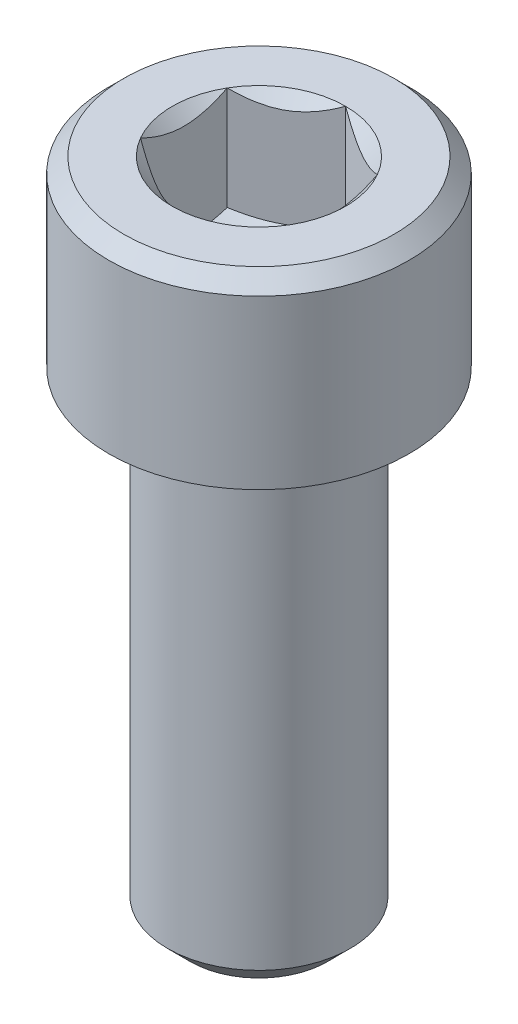
ISO-10303-21;
HEADER;
FILE_DESCRIPTION(('STEP AP214'),'2;1');
FILE_NAME('part.step','',(''),(''),'','','');
FILE_SCHEMA(('AUTOMOTIVE_DESIGN { 1 0 10303 214 1 1 1 1 }'));
ENDSEC;
DATA;
#1=APPLICATION_CONTEXT('core data for automotive mechanical design processes');
#2=APPLICATION_PROTOCOL_DEFINITION('international standard','automotive_design',2000,#1);
#3=PRODUCT_CONTEXT('',#1,'mechanical');
#4=PRODUCT('Part','Part','',(#3));
#5=PRODUCT_RELATED_PRODUCT_CATEGORY('part','',(#4));
#6=PRODUCT_DEFINITION_FORMATION('','',#4);
#7=PRODUCT_DEFINITION_CONTEXT('part definition',#1,'design');
#8=PRODUCT_DEFINITION('design','',#6,#7);
#9=PRODUCT_DEFINITION_SHAPE('','',#8);
#10=(LENGTH_UNIT() NAMED_UNIT(*) SI_UNIT(.MILLI.,.METRE.));
#11=(NAMED_UNIT(*) PLANE_ANGLE_UNIT() SI_UNIT($,.RADIAN.));
#12=(NAMED_UNIT(*) SI_UNIT($,.STERADIAN.) SOLID_ANGLE_UNIT());
#13=UNCERTAINTY_MEASURE_WITH_UNIT(LENGTH_MEASURE(1.E-05),#10,'distance_accuracy_value','');
#14=(GEOMETRIC_REPRESENTATION_CONTEXT(3) GLOBAL_UNCERTAINTY_ASSIGNED_CONTEXT((#13)) GLOBAL_UNIT_ASSIGNED_CONTEXT((#10,
#11,#12)) REPRESENTATION_CONTEXT('',''));
#15=CARTESIAN_POINT('',(0.,0.,0.));
#16=DIRECTION('',(0.,0.,1.));
#17=DIRECTION('',(1.,0.,0.));
#18=AXIS2_PLACEMENT_3D('',#15,#16,#17);
#19=CARTESIAN_POINT('',(0.,1.905,0.));
#20=DIRECTION('',(0.,1.,0.));
#21=DIRECTION('',(0.,0.,1.));
#22=AXIS2_PLACEMENT_3D('',#19,#20,#21);
#23=CONICAL_SURFACE('',#22,1.984375,1.02974425867665);
#24=CARTESIAN_POINT('',(-1.984375,2.08945452467681,1.14567944042317));
#25=CARTESIAN_POINT('',(-1.89685791021679,2.0590861847188,1.1962074557682));
#26=CARTESIAN_POINT('',(-1.80852255746267,2.03145527648912,1.24720789545975));
#27=CARTESIAN_POINT('',(-1.63018969738012,1.98324026195152,1.35016842023377));
#28=CARTESIAN_POINT('',(-1.54018840618136,1.96267502066874,1.40213068993478));
#29=CARTESIAN_POINT('',(-1.36139479016803,1.93077531269735,1.50535723226947));
#30=CARTESIAN_POINT('',(-1.27263480151602,1.91920802096974,1.55660283561097));
#31=CARTESIAN_POINT('',(-1.09467265242059,1.9055467143691,1.65934933029678));
#32=CARTESIAN_POINT('',(-1.00547125760877,1.90343983574995,1.71084977960348));
#33=CARTESIAN_POINT('',(-0.839606749149415,1.90850314096893,1.80661169821149));
#34=CARTESIAN_POINT('',(-0.762912622387407,1.91443284064114,1.8508910729428));
#35=CARTESIAN_POINT('',(-0.610067765084995,1.93300203864047,1.9391360924506));
#36=CARTESIAN_POINT('',(-0.533917661028398,1.94564830223213,1.98310137552649));
#37=CARTESIAN_POINT('',(-0.380741308301366,1.97717794353986,2.07153778400693));
#38=CARTESIAN_POINT('',(-0.303737509772877,1.99620294486019,2.11599594781597));
#39=CARTESIAN_POINT('',(-0.150963847734405,2.03930521354597,2.20419986271897));
#40=CARTESIAN_POINT('',(-0.0751916973611979,2.0633715882419,2.24794693413402));
#41=CARTESIAN_POINT('',(0.,2.08945452467681,2.29135888084633));
#42=B_SPLINE_CURVE_WITH_KNOTS('',3,(#24,#25,#26,#27,#28,#29,#30,#31,#32,#33,#34,#35,#36,#37,#38,
#39,#40,#41),.UNSPECIFIED.,.F.,.F.,(4,2,2,2,2,2,2,2,4),(0.,0.316701120931043,0.634241366076831,
0.943263287067313,1.25186488965989,1.5178662353713,1.78413602070682,2.05675926657475,
2.3287994336137),.UNSPECIFIED.);
#43=CARTESIAN_POINT('',(-1.984375,2.08945452467681,1.14567944042317));
#44=VERTEX_POINT('',#43);
#45=CARTESIAN_POINT('',(0.,2.08945452467681,2.29135888084633));
#46=VERTEX_POINT('',#45);
#47=EDGE_CURVE('E109',#44,#46,#42,.T.);
#48=ORIENTED_EDGE('',*,*,#47,.T.);
#49=CARTESIAN_POINT('',(0.,2.08945452467681,2.29135888084633));
#50=CARTESIAN_POINT('',(0.0875170897832179,2.0590861847188,2.2408308655013));
#51=CARTESIAN_POINT('',(0.175852442537339,2.03145527648912,2.18983042580975));
#52=CARTESIAN_POINT('',(0.35418530261989,1.98324026195152,2.08686990103573));
#53=CARTESIAN_POINT('',(0.444186593818646,1.96267502066874,2.03490763133471));
#54=CARTESIAN_POINT('',(0.622980209831976,1.93077531269735,1.93168108900003));
#55=CARTESIAN_POINT('',(0.71174019848399,1.91920802096974,1.88043548565852));
#56=CARTESIAN_POINT('',(0.889702347579416,1.9055467143691,1.77768899097271));
#57=CARTESIAN_POINT('',(0.978903742391237,1.90343983574995,1.72618854166602));
#58=CARTESIAN_POINT('',(1.14476825085059,1.90850314096893,1.63042662305801));
#59=CARTESIAN_POINT('',(1.2214623776126,1.91443284064114,1.5861472483267));
#60=CARTESIAN_POINT('',(1.37430723491501,1.93300203864047,1.4979022288189));
#61=CARTESIAN_POINT('',(1.45045733897161,1.94564830223213,1.45393694574301));
#62=CARTESIAN_POINT('',(1.60363369169864,1.97717794353986,1.36550053726257));
#63=CARTESIAN_POINT('',(1.68063749022713,1.99620294486019,1.32104237345352));
#64=CARTESIAN_POINT('',(1.8334111522656,2.03930521354597,1.23283845855053));
#65=CARTESIAN_POINT('',(1.90918330263881,2.0633715882419,1.18909138713548));
#66=CARTESIAN_POINT('',(1.984375,2.08945452467681,1.14567944042317));
#67=B_SPLINE_CURVE_WITH_KNOTS('',3,(#49,#50,#51,#52,#53,#54,#55,#56,#57,#58,#59,#60,#61,#62,#63,
#64,#65,#66),.UNSPECIFIED.,.F.,.F.,(4,2,2,2,2,2,2,2,4),(0.,0.316701120931043,0.63424136607683,
0.943263287067312,1.25186488965989,1.51786623537129,1.78413602070682,2.05675926657475,
2.3287994336137),.UNSPECIFIED.);
#68=CARTESIAN_POINT('',(1.984375,2.08945452467681,1.14567944042316));
#69=VERTEX_POINT('',#68);
#70=EDGE_CURVE('E111',#46,#69,#67,.T.);
#71=ORIENTED_EDGE('',*,*,#70,.T.);
#72=CARTESIAN_POINT('',(1.984375,2.08945452467681,1.14567944042316));
#73=CARTESIAN_POINT('',(1.984375,2.0590861847188,1.0446234097331));
#74=CARTESIAN_POINT('',(1.984375,2.03145527648912,0.942622530349999));
#75=CARTESIAN_POINT('',(1.984375,1.98324026195152,0.736701480801966));
#76=CARTESIAN_POINT('',(1.984375,1.96267502066874,0.632776941399934));
#77=CARTESIAN_POINT('',(1.984375,1.93077531269735,0.426323856730569));
#78=CARTESIAN_POINT('',(1.984375,1.91920802096974,0.323832650047553));
#79=CARTESIAN_POINT('',(1.984375,1.9055467143691,0.118339660675936));
#80=CARTESIAN_POINT('',(1.984375,1.90343983574995,0.0153387620625464));
#81=CARTESIAN_POINT('',(1.984375,1.90850314096893,-0.176185075153482));
#82=CARTESIAN_POINT('',(1.984375,1.91443284064114,-0.264743824616099));
#83=CARTESIAN_POINT('',(1.984375,1.93300203864047,-0.441233863631693));
#84=CARTESIAN_POINT('',(1.984375,1.94564830223213,-0.529164429783481));
#85=CARTESIAN_POINT('',(1.984375,1.97717794353986,-0.706037246744355));
#86=CARTESIAN_POINT('',(1.984375,1.99620294486018,-0.794953574362449));
#87=CARTESIAN_POINT('',(1.984375,2.03930521354597,-0.971361404168442));
#88=CARTESIAN_POINT('',(1.984375,2.06337158824189,-1.05885554699854));
#89=CARTESIAN_POINT('',(1.984375,2.08945452467681,-1.14567944042316));
#90=B_SPLINE_CURVE_WITH_KNOTS('',3,(#72,#73,#74,#75,#76,#77,#78,#79,#80,#81,#82,#83,#84,#85,#86,
#87,#88,#89),.UNSPECIFIED.,.F.,.F.,(4,2,2,2,2,2,2,2,4),(0.,0.316701120931043,0.63424136607683,
0.943263287067311,1.25186488965989,1.51786623537129,1.78413602070682,2.05675926657475,
2.3287994336137),.UNSPECIFIED.);
#91=CARTESIAN_POINT('',(1.984375,2.08945452467681,-1.14567944042316));
#92=VERTEX_POINT('',#91);
#93=EDGE_CURVE('E34',#69,#92,#90,.T.);
#94=ORIENTED_EDGE('',*,*,#93,.T.);
#95=CARTESIAN_POINT('',(1.984375,2.08945452467681,-1.14567944042317));
#96=CARTESIAN_POINT('',(1.89685791021679,2.0590861847188,-1.19620745576819));
#97=CARTESIAN_POINT('',(1.80852255746267,2.03145527648912,-1.24720789545975));
#98=CARTESIAN_POINT('',(1.63018969738012,1.98324026195152,-1.35016842023376));
#99=CARTESIAN_POINT('',(1.54018840618136,1.96267502066875,-1.40213068993478));
#100=CARTESIAN_POINT('',(1.36139479016803,1.93077531269735,-1.50535723226946));
#101=CARTESIAN_POINT('',(1.27263480151602,1.91920802096974,-1.55660283561097));
#102=CARTESIAN_POINT('',(1.09467265242059,1.9055467143691,-1.65934933029678));
#103=CARTESIAN_POINT('',(1.00547125760877,1.90343983574995,-1.71084977960347));
#104=CARTESIAN_POINT('',(0.839606749149417,1.90850314096893,-1.80661169821149));
#105=CARTESIAN_POINT('',(0.762912622387409,1.91443284064114,-1.8508910729428));
#106=CARTESIAN_POINT('',(0.610067765084996,1.93300203864047,-1.9391360924506));
#107=CARTESIAN_POINT('',(0.533917661028399,1.94564830223213,-1.98310137552649));
#108=CARTESIAN_POINT('',(0.380741308301367,1.97717794353986,-2.07153778400693));
#109=CARTESIAN_POINT('',(0.303737509772877,1.99620294486019,-2.11599594781597));
#110=CARTESIAN_POINT('',(0.150963847734404,2.03930521354597,-2.20419986271897));
#111=CARTESIAN_POINT('',(0.0751916973611967,2.0633715882419,-2.24794693413402));
#112=CARTESIAN_POINT('',(0.,2.08945452467681,-2.29135888084633));
#113=B_SPLINE_CURVE_WITH_KNOTS('',3,(#95,#96,#97,#98,#99,#100,#101,#102,#103,#104,#105,#106,
#107,#108,#109,#110,#111,#112),.UNSPECIFIED.,.F.,.F.,(4,2,2,2,2,2,2,2,4),(0.,0.316701120931043,
0.634241366076831,0.943263287067313,1.25186488965989,1.5178662353713,1.78413602070683,
2.05675926657475,2.32879943361371),.UNSPECIFIED.);
#114=CARTESIAN_POINT('',(0.,2.08945452467681,-2.29135888084632));
#115=VERTEX_POINT('',#114);
#116=EDGE_CURVE('E11',#92,#115,#113,.T.);
#117=ORIENTED_EDGE('',*,*,#116,.T.);
#118=CARTESIAN_POINT('',(0.,2.08945452467681,-2.29135888084633));
#119=CARTESIAN_POINT('',(-0.0875170897832188,2.0590861847188,-2.2408308655013));
#120=CARTESIAN_POINT('',(-0.17585244253734,2.03145527648912,-2.18983042580975));
#121=CARTESIAN_POINT('',(-0.354185302619891,1.98324026195152,-2.08686990103573));
#122=CARTESIAN_POINT('',(-0.444186593818647,1.96267502066874,-2.03490763133471));
#123=CARTESIAN_POINT('',(-0.622980209831977,1.93077531269735,-1.93168108900003));
#124=CARTESIAN_POINT('',(-0.71174019848399,1.91920802096974,-1.88043548565852));
#125=CARTESIAN_POINT('',(-0.889702347579416,1.9055467143691,-1.77768899097271));
#126=CARTESIAN_POINT('',(-0.978903742391237,1.90343983574995,-1.72618854166602));
#127=CARTESIAN_POINT('',(-1.14476825085059,1.90850314096893,-1.630426623058));
#128=CARTESIAN_POINT('',(-1.2214623776126,1.91443284064114,-1.5861472483267));
#129=CARTESIAN_POINT('',(-1.37430723491501,1.93300203864047,-1.4979022288189));
#130=CARTESIAN_POINT('',(-1.45045733897161,1.94564830223213,-1.45393694574301));
#131=CARTESIAN_POINT('',(-1.60363369169864,1.97717794353986,-1.36550053726257));
#132=CARTESIAN_POINT('',(-1.68063749022713,1.99620294486019,-1.32104237345352));
#133=CARTESIAN_POINT('',(-1.8334111522656,2.03930521354597,-1.23283845855053));
#134=CARTESIAN_POINT('',(-1.9091833026388,2.0633715882419,-1.18909138713548));
#135=CARTESIAN_POINT('',(-1.984375,2.08945452467681,-1.14567944042317));
#136=B_SPLINE_CURVE_WITH_KNOTS('',3,(#118,#119,#120,#121,#122,#123,#124,#125,#126,#127,#128,
#129,#130,#131,#132,#133,#134,#135),.UNSPECIFIED.,.F.,.F.,(4,2,2,2,2,2,2,2,4),(0.,
0.316701120931042,0.63424136607683,0.943263287067311,1.25186488965989,1.51786623537129,
1.78413602070682,2.05675926657474,2.3287994336137),.UNSPECIFIED.);
#137=CARTESIAN_POINT('',(-1.984375,2.08945452467681,-1.14567944042317));
#138=VERTEX_POINT('',#137);
#139=EDGE_CURVE('E250',#115,#138,#136,.T.);
#140=ORIENTED_EDGE('',*,*,#139,.T.);
#141=CARTESIAN_POINT('',(-1.984375,2.08945452467681,-1.14567944042317));
#142=CARTESIAN_POINT('',(-1.984375,2.0590861847188,-1.04462340973311));
#143=CARTESIAN_POINT('',(-1.984375,2.03145527648912,-0.942622530350008));
#144=CARTESIAN_POINT('',(-1.984375,1.98324026195152,-0.736701480801974));
#145=CARTESIAN_POINT('',(-1.984375,1.96267502066874,-0.632776941399942));
#146=CARTESIAN_POINT('',(-1.984375,1.93077531269735,-0.426323856730577));
#147=CARTESIAN_POINT('',(-1.984375,1.91920802096974,-0.323832650047561));
#148=CARTESIAN_POINT('',(-1.984375,1.9055467143691,-0.118339660675944));
#149=CARTESIAN_POINT('',(-1.984375,1.90343983574995,-0.0153387620625538));
#150=CARTESIAN_POINT('',(-1.984375,1.90850314096893,0.176185075153476));
#151=CARTESIAN_POINT('',(-1.984375,1.91443284064114,0.264743824616094));
#152=CARTESIAN_POINT('',(-1.984375,1.93300203864047,0.441233863631692));
#153=CARTESIAN_POINT('',(-1.984375,1.94564830223213,0.529164429783481));
#154=CARTESIAN_POINT('',(-1.984375,1.97717794353986,0.706037246744357));
#155=CARTESIAN_POINT('',(-1.984375,1.99620294486018,0.794953574362452));
#156=CARTESIAN_POINT('',(-1.984375,2.03930521354597,0.971361404168448));
#157=CARTESIAN_POINT('',(-1.984375,2.0633715882419,1.05885554699855));
#158=CARTESIAN_POINT('',(-1.984375,2.08945452467681,1.14567944042317));
#159=B_SPLINE_CURVE_WITH_KNOTS('',3,(#141,#142,#143,#144,#145,#146,#147,#148,#149,#150,#151,
#152,#153,#154,#155,#156,#157,#158),.UNSPECIFIED.,.F.,.F.,(4,2,2,2,2,2,2,2,4),(0.,
0.316701120931043,0.634241366076831,0.943263287067313,1.25186488965989,1.5178662353713,
1.78413602070683,2.05675926657476,2.32879943361372),.UNSPECIFIED.);
#160=EDGE_CURVE('E113',#138,#44,#159,.T.);
#161=ORIENTED_EDGE('',*,*,#160,.T.);
#162=EDGE_LOOP('',(#48,#71,#94,#117,#140,#161));
#163=FACE_BOUND('',#162,.T.);
#164=CARTESIAN_POINT('',(0.,0.712667209117186,0.));
#165=VERTEX_POINT('',#164);
#166=VERTEX_LOOP('',#165);
#167=FACE_BOUND('',#166,.T.);
#168=ADVANCED_FACE('F17',(#163,#167),#23,.F.);
#169=CARTESIAN_POINT('',(0.9921875,-1.11065121348229,-1.71851916063475));
#170=DIRECTION('',(0.5,0.,-0.866025403784439));
#171=DIRECTION('',(0.,-1.,0.));
#172=AXIS2_PLACEMENT_3D('',#169,#170,#171);
#173=PLANE('',#172);
#174=CARTESIAN_POINT('',(0.,4.82600000000001,-2.29135888084633));
#175=CARTESIAN_POINT('',(0.0682039378738271,4.78666022797376,-2.25198131895508));
#176=CARTESIAN_POINT('',(0.137548246988862,4.7496313284863,-2.21194536342075));
#177=CARTESIAN_POINT('',(0.278948409543804,4.6818329942982,-2.1303079415062));
#178=CARTESIAN_POINT('',(0.351017702798735,4.65110127024186,-2.08869871564516));
#179=CARTESIAN_POINT('',(0.496341897580651,4.59845762015669,-2.00479575266805));
#180=CARTESIAN_POINT('',(0.569559809364976,4.57641341201144,-1.96252337158987));
#181=CARTESIAN_POINT('',(0.717607077470968,4.54245011072851,-1.87704824149609));
#182=CARTESIAN_POINT('',(0.79243191441287,4.53050567477444,-1.83384810174561));
#183=CARTESIAN_POINT('',(0.921395967954395,4.51972842757899,-1.75939067071763));
#184=CARTESIAN_POINT('',(0.975368691595693,4.51813352800389,-1.72822950419443));
#185=CARTESIAN_POINT('',(1.08322583079147,4.52082392144195,-1.66595815584572));
#186=CARTESIAN_POINT('',(1.13711020876648,4.52511127551501,-1.63484799571673));
#187=CARTESIAN_POINT('',(1.2443700798164,4.53932219427194,-1.57292148029282));
#188=CARTESIAN_POINT('',(1.29774493597642,4.54925206051398,-1.54210549272087));
#189=CARTESIAN_POINT('',(1.40357163687749,4.57420294850379,-1.48100641846819));
#190=CARTESIAN_POINT('',(1.45602355208164,4.5892235798011,-1.45072329110556));
#191=CARTESIAN_POINT('',(1.59034408410465,4.6338047890603,-1.37317329578438));
#192=CARTESIAN_POINT('',(1.67138069095343,4.6667221338951,-1.32638678900602));
#193=CARTESIAN_POINT('',(1.79053879221177,4.72228952044028,-1.2575908271684));
#194=CARTESIAN_POINT('',(1.82980683300039,4.74181309380849,-1.23491941324854));
#195=CARTESIAN_POINT('',(1.90761582761202,4.78263970070617,-1.18999636926414));
#196=CARTESIAN_POINT('',(1.9461572095267,4.80394164367654,-1.16774449204076));
#197=CARTESIAN_POINT('',(1.984375,4.82600000000001,-1.14567944042317));
#198=B_SPLINE_CURVE_WITH_KNOTS('',3,(#174,#175,#176,#177,#178,#179,#180,#181,#182,#183,#184,
#185,#186,#187,#188,#189,#190,#191,#192,#193,#194,#195,#196,#197),.UNSPECIFIED.,.F.,.F.,(4,2,2,
2,2,2,2,2,2,2,2,4),(0.,0.264284909621037,0.530108996347133,0.791712695398036,1.05265800172284,
1.23942150114577,1.42625045661727,1.61328847392059,1.80031214906534,2.09727151178961,
2.24534838941339,2.39333511885325),.UNSPECIFIED.);
#199=CARTESIAN_POINT('',(0.,4.82600000000001,-2.29135888084632));
#200=VERTEX_POINT('',#199);
#201=CARTESIAN_POINT('',(1.984375,4.82600000000001,-1.14567944042316));
#202=VERTEX_POINT('',#201);
#203=EDGE_CURVE('E144',#200,#202,#198,.T.);
#204=ORIENTED_EDGE('',*,*,#203,.F.);
#205=DIRECTION('',(0.,1.,0.));
#206=VECTOR('',#205,1.);
#207=CARTESIAN_POINT('',(0.,-1.11065121348229,-2.29135888084632));
#208=LINE('',#207,#206);
#209=EDGE_CURVE('E272',#115,#200,#208,.T.);
#210=ORIENTED_EDGE('',*,*,#209,.F.);
#211=ORIENTED_EDGE('',*,*,#116,.F.);
#212=DIRECTION('',(0.,1.,0.));
#213=VECTOR('',#212,1.);
#214=CARTESIAN_POINT('',(1.984375,-1.11065121348229,-1.14567944042317));
#215=LINE('',#214,#213);
#216=EDGE_CURVE('E407',#92,#202,#215,.T.);
#217=ORIENTED_EDGE('',*,*,#216,.T.);
#218=EDGE_LOOP('',(#204,#210,#211,#217));
#219=FACE_BOUND('',#218,.T.);
#220=ADVANCED_FACE('F99',(#219),#173,.F.);
#221=CARTESIAN_POINT('',(1.984375,-1.11065121348229,0.));
#222=DIRECTION('',(1.,0.,0.));
#223=DIRECTION('',(0.,1.,0.));
#224=AXIS2_PLACEMENT_3D('',#221,#222,#223);
#225=PLANE('',#224);
#226=CARTESIAN_POINT('',(1.984375,4.82600000000001,-1.14567944042316));
#227=CARTESIAN_POINT('',(1.984375,4.78666022797376,-1.06692431664067));
#228=CARTESIAN_POINT('',(1.984375,4.74963132848629,-0.986852405572002));
#229=CARTESIAN_POINT('',(1.984375,4.6818329942982,-0.823577561742896));
#230=CARTESIAN_POINT('',(1.984375,4.65110127024186,-0.740359110020816));
#231=CARTESIAN_POINT('',(1.984375,4.59845762015669,-0.572553184066607));
#232=CARTESIAN_POINT('',(1.984375,4.57641341201144,-0.488008421910243));
#233=CARTESIAN_POINT('',(1.984375,4.54245011072851,-0.317058161722677));
#234=CARTESIAN_POINT('',(1.984375,4.53050567477444,-0.230657882221723));
#235=CARTESIAN_POINT('',(1.984375,4.51972842757898,-0.0817430201657528));
#236=CARTESIAN_POINT('',(1.984375,4.51813352800389,-0.0194206871193526));
#237=CARTESIAN_POINT('',(1.984375,4.52082392144195,0.105122009578055));
#238=CARTESIAN_POINT('',(1.984375,4.52511127551501,0.167342329836031));
#239=CARTESIAN_POINT('',(1.984375,4.53932219427194,0.291195360683867));
#240=CARTESIAN_POINT('',(1.984375,4.54925206051397,0.352827335827753));
#241=CARTESIAN_POINT('',(1.984375,4.57420294850378,0.475025484333123));
#242=CARTESIAN_POINT('',(1.984375,4.58922357980109,0.535591739058374));
#243=CARTESIAN_POINT('',(1.984375,4.6338047890603,0.690691729700731));
#244=CARTESIAN_POINT('',(1.984375,4.66672213389509,0.784264743257447));
#245=CARTESIAN_POINT('',(1.984375,4.72228952044027,0.921856666932699));
#246=CARTESIAN_POINT('',(1.984375,4.74181309380848,0.967199494772415));
#247=CARTESIAN_POINT('',(1.984375,4.78263970070616,1.05704558274122));
#248=CARTESIAN_POINT('',(1.984375,4.80394164367653,1.10154933718798));
#249=CARTESIAN_POINT('',(1.984375,4.826,1.14567944042316));
#250=B_SPLINE_CURVE_WITH_KNOTS('',3,(#226,#227,#228,#229,#230,#231,#232,#233,#234,#235,#236,
#237,#238,#239,#240,#241,#242,#243,#244,#245,#246,#247,#248,#249),.UNSPECIFIED.,.F.,.F.,(4,2,2,
2,2,2,2,2,2,2,2,4),(0.,0.264284909621036,0.530108996347131,0.791712695398034,1.05265800172283,
1.23942150114577,1.42625045661727,1.61328847392058,1.80031214906534,2.0972715117896,
2.24534838941338,2.39333511885325),.UNSPECIFIED.);
#251=CARTESIAN_POINT('',(1.98437499999999,4.826,1.14567944042316));
#252=VERTEX_POINT('',#251);
#253=EDGE_CURVE('E157',#202,#252,#250,.T.);
#254=ORIENTED_EDGE('',*,*,#253,.F.);
#255=ORIENTED_EDGE('',*,*,#216,.F.);
#256=ORIENTED_EDGE('',*,*,#93,.F.);
#257=DIRECTION('',(0.,1.,0.));
#258=VECTOR('',#257,1.);
#259=CARTESIAN_POINT('',(1.984375,-1.11065121348229,1.14567944042316));
#260=LINE('',#259,#258);
#261=EDGE_CURVE('E91',#69,#252,#260,.T.);
#262=ORIENTED_EDGE('',*,*,#261,.T.);
#263=EDGE_LOOP('',(#254,#255,#256,#262));
#264=FACE_BOUND('',#263,.T.);
#265=ADVANCED_FACE('F105',(#264),#225,.F.);
#266=CARTESIAN_POINT('',(-0.9921875,-1.11065121348229,-1.71851916063475));
#267=DIRECTION('',(-0.5,0.,-0.866025403784439));
#268=DIRECTION('',(-0.866025403784439,0.,0.5));
#269=AXIS2_PLACEMENT_3D('',#266,#267,#268);
#270=PLANE('',#269);
#271=CARTESIAN_POINT('',(-1.984375,4.82600000000001,-1.14567944042317));
#272=CARTESIAN_POINT('',(-1.91617106212617,4.78666022797376,-1.18505700231441));
#273=CARTESIAN_POINT('',(-1.84682675301114,4.7496313284863,-1.22509295784875));
#274=CARTESIAN_POINT('',(-1.7054265904562,4.6818329942982,-1.3067303797633));
#275=CARTESIAN_POINT('',(-1.63335729720127,4.65110127024186,-1.34833960562434));
#276=CARTESIAN_POINT('',(-1.48803310241935,4.59845762015669,-1.43224256860145));
#277=CARTESIAN_POINT('',(-1.41481519063503,4.57641341201144,-1.47451494967963));
#278=CARTESIAN_POINT('',(-1.26676792252903,4.54245011072851,-1.55999007977341));
#279=CARTESIAN_POINT('',(-1.19194308558713,4.53050567477444,-1.60319021952389));
#280=CARTESIAN_POINT('',(-1.06297903204561,4.51972842757899,-1.67764765055187));
#281=CARTESIAN_POINT('',(-1.00900630840431,4.51813352800389,-1.70880881707507));
#282=CARTESIAN_POINT('',(-0.901149169208534,4.52082392144195,-1.77108016542378));
#283=CARTESIAN_POINT('',(-0.847264791233524,4.52511127551501,-1.80219032555276));
#284=CARTESIAN_POINT('',(-0.7400049201836,4.53932219427194,-1.86411684097668));
#285=CARTESIAN_POINT('',(-0.686630064023584,4.54925206051398,-1.89493282854863));
#286=CARTESIAN_POINT('',(-0.580803363122509,4.57420294850379,-1.95603190280131));
#287=CARTESIAN_POINT('',(-0.528351447918363,4.5892235798011,-1.98631503016394));
#288=CARTESIAN_POINT('',(-0.394030915895353,4.6338047890603,-2.06386502548511));
#289=CARTESIAN_POINT('',(-0.312994309046573,4.6667221338951,-2.11065153226347));
#290=CARTESIAN_POINT('',(-0.193836207788237,4.72228952044028,-2.1794474941011));
#291=CARTESIAN_POINT('',(-0.154568166999619,4.74181309380848,-2.20211890802095));
#292=CARTESIAN_POINT('',(-0.0767591723879864,4.78263970070616,-2.24704195200535));
#293=CARTESIAN_POINT('',(-0.038217790473309,4.80394164367653,-2.26929382922873));
#294=CARTESIAN_POINT('',(0.,4.82600000000001,-2.29135888084632));
#295=B_SPLINE_CURVE_WITH_KNOTS('',3,(#271,#272,#273,#274,#275,#276,#277,#278,#279,#280,#281,
#282,#283,#284,#285,#286,#287,#288,#289,#290,#291,#292,#293,#294),.UNSPECIFIED.,.F.,.F.,(4,2,2,
2,2,2,2,2,2,2,2,4),(0.,0.264284909621036,0.530108996347132,0.791712695398034,1.05265800172283,
1.23942150114577,1.42625045661727,1.61328847392058,1.80031214906534,2.0972715117896,
2.24534838941338,2.39333511885324),.UNSPECIFIED.);
#296=CARTESIAN_POINT('',(-1.984375,4.826,-1.14567944042316));
#297=VERTEX_POINT('',#296);
#298=EDGE_CURVE('E150',#297,#200,#295,.T.);
#299=ORIENTED_EDGE('',*,*,#298,.F.);
#300=DIRECTION('',(0.,1.,0.));
#301=VECTOR('',#300,1.);
#302=CARTESIAN_POINT('',(-1.984375,-1.11065121348229,-1.14567944042317));
#303=LINE('',#302,#301);
#304=EDGE_CURVE('E127',#138,#297,#303,.T.);
#305=ORIENTED_EDGE('',*,*,#304,.F.);
#306=ORIENTED_EDGE('',*,*,#139,.F.);
#307=ORIENTED_EDGE('',*,*,#209,.T.);
#308=EDGE_LOOP('',(#299,#305,#306,#307));
#309=FACE_BOUND('',#308,.T.);
#310=ADVANCED_FACE('F257',(#309),#270,.F.);
#311=CARTESIAN_POINT('',(0.9921875,-1.11065121348229,1.71851916063475));
#312=DIRECTION('',(0.5,0.,0.866025403784439));
#313=DIRECTION('',(0.,-1.,0.));
#314=AXIS2_PLACEMENT_3D('',#311,#312,#313);
#315=PLANE('',#314);
#316=CARTESIAN_POINT('',(1.984375,4.82600000000001,1.14567944042317));
#317=CARTESIAN_POINT('',(1.91617106212618,4.78666022797376,1.18505700231441));
#318=CARTESIAN_POINT('',(1.84682675301114,4.7496313284863,1.22509295784875));
#319=CARTESIAN_POINT('',(1.7054265904562,4.6818329942982,1.3067303797633));
#320=CARTESIAN_POINT('',(1.63335729720127,4.65110127024186,1.34833960562434));
#321=CARTESIAN_POINT('',(1.48803310241935,4.59845762015669,1.43224256860145));
#322=CARTESIAN_POINT('',(1.41481519063503,4.57641341201144,1.47451494967963));
#323=CARTESIAN_POINT('',(1.26676792252904,4.54245011072851,1.55999007977341));
#324=CARTESIAN_POINT('',(1.19194308558713,4.53050567477444,1.60319021952389));
#325=CARTESIAN_POINT('',(1.06297903204561,4.51972842757899,1.67764765055187));
#326=CARTESIAN_POINT('',(1.00900630840431,4.51813352800389,1.70880881707507));
#327=CARTESIAN_POINT('',(0.901149169208536,4.52082392144195,1.77108016542378));
#328=CARTESIAN_POINT('',(0.847264791233525,4.52511127551501,1.80219032555276));
#329=CARTESIAN_POINT('',(0.740004920183602,4.53932219427194,1.86411684097668));
#330=CARTESIAN_POINT('',(0.686630064023585,4.54925206051398,1.89493282854863));
#331=CARTESIAN_POINT('',(0.580803363122511,4.57420294850379,1.95603190280131));
#332=CARTESIAN_POINT('',(0.528351447918365,4.5892235798011,1.98631503016394));
#333=CARTESIAN_POINT('',(0.394030915895355,4.6338047890603,2.06386502548511));
#334=CARTESIAN_POINT('',(0.312994309046574,4.6667221338951,2.11065153226347));
#335=CARTESIAN_POINT('',(0.193836207788237,4.72228952044028,2.1794474941011));
#336=CARTESIAN_POINT('',(0.154568166999619,4.74181309380848,2.20211890802096));
#337=CARTESIAN_POINT('',(0.0767591723879868,4.78263970070616,2.24704195200536));
#338=CARTESIAN_POINT('',(0.0382177904733091,4.80394164367653,2.26929382922874));
#339=CARTESIAN_POINT('',(0.,4.82600000000001,2.29135888084633));
#340=B_SPLINE_CURVE_WITH_KNOTS('',3,(#316,#317,#318,#319,#320,#321,#322,#323,#324,#325,#326,
#327,#328,#329,#330,#331,#332,#333,#334,#335,#336,#337,#338,#339),.UNSPECIFIED.,.F.,.F.,(4,2,2,
2,2,2,2,2,2,2,2,4),(0.,0.264284909621037,0.530108996347132,0.791712695398036,1.05265800172284,
1.23942150114577,1.42625045661727,1.61328847392059,1.80031214906534,2.0972715117896,
2.24534838941338,2.39333511885324),.UNSPECIFIED.);
#341=CARTESIAN_POINT('',(0.,4.826,2.29135888084632));
#342=VERTEX_POINT('',#341);
#343=EDGE_CURVE('E21',#252,#342,#340,.T.);
#344=ORIENTED_EDGE('',*,*,#343,.F.);
#345=ORIENTED_EDGE('',*,*,#261,.F.);
#346=ORIENTED_EDGE('',*,*,#70,.F.);
#347=DIRECTION('',(0.,1.,0.));
#348=VECTOR('',#347,1.);
#349=CARTESIAN_POINT('',(0.,-1.11065121348229,2.29135888084632));
#350=LINE('',#349,#348);
#351=EDGE_CURVE('E117',#46,#342,#350,.T.);
#352=ORIENTED_EDGE('',*,*,#351,.T.);
#353=EDGE_LOOP('',(#344,#345,#346,#352));
#354=FACE_BOUND('',#353,.T.);
#355=ADVANCED_FACE('F235',(#354),#315,.F.);
#356=CARTESIAN_POINT('',(-0.9921875,-1.11065121348229,1.71851916063475));
#357=DIRECTION('',(-0.5,0.,0.866025403784439));
#358=DIRECTION('',(0.,1.,0.));
#359=AXIS2_PLACEMENT_3D('',#356,#357,#358);
#360=PLANE('',#359);
#361=CARTESIAN_POINT('',(0.,4.82600000000001,2.29135888084633));
#362=CARTESIAN_POINT('',(-0.0682039378738293,4.78666022797376,2.25198131895509));
#363=CARTESIAN_POINT('',(-0.137548246988864,4.7496313284863,2.21194536342075));
#364=CARTESIAN_POINT('',(-0.278948409543806,4.6818329942982,2.1303079415062));
#365=CARTESIAN_POINT('',(-0.351017702798736,4.65110127024186,2.08869871564516));
#366=CARTESIAN_POINT('',(-0.496341897580652,4.59845762015669,2.00479575266805));
#367=CARTESIAN_POINT('',(-0.569559809364977,4.57641341201144,1.96252337158987));
#368=CARTESIAN_POINT('',(-0.717607077470968,4.54245011072851,1.87704824149609));
#369=CARTESIAN_POINT('',(-0.79243191441287,4.53050567477444,1.83384810174561));
#370=CARTESIAN_POINT('',(-0.921395967954396,4.51972842757899,1.75939067071763));
#371=CARTESIAN_POINT('',(-0.975368691595693,4.51813352800389,1.72822950419443));
#372=CARTESIAN_POINT('',(-1.08322583079147,4.52082392144195,1.66595815584572));
#373=CARTESIAN_POINT('',(-1.13711020876648,4.52511127551501,1.63484799571673));
#374=CARTESIAN_POINT('',(-1.2443700798164,4.53932219427194,1.57292148029282));
#375=CARTESIAN_POINT('',(-1.29774493597642,4.54925206051398,1.54210549272087));
#376=CARTESIAN_POINT('',(-1.40357163687749,4.57420294850379,1.48100641846819));
#377=CARTESIAN_POINT('',(-1.45602355208164,4.5892235798011,1.45072329110556));
#378=CARTESIAN_POINT('',(-1.59034408410465,4.6338047890603,1.37317329578438));
#379=CARTESIAN_POINT('',(-1.67138069095343,4.6667221338951,1.32638678900603));
#380=CARTESIAN_POINT('',(-1.79053879221177,4.72228952044028,1.2575908271684));
#381=CARTESIAN_POINT('',(-1.82980683300039,4.74181309380849,1.23491941324854));
#382=CARTESIAN_POINT('',(-1.90761582761202,4.78263970070616,1.18999636926414));
#383=CARTESIAN_POINT('',(-1.9461572095267,4.80394164367653,1.16774449204076));
#384=CARTESIAN_POINT('',(-1.984375,4.82600000000001,1.14567944042317));
#385=B_SPLINE_CURVE_WITH_KNOTS('',3,(#361,#362,#363,#364,#365,#366,#367,#368,#369,#370,#371,
#372,#373,#374,#375,#376,#377,#378,#379,#380,#381,#382,#383,#384),.UNSPECIFIED.,.F.,.F.,(4,2,2,
2,2,2,2,2,2,2,2,4),(0.,0.264284909621036,0.530108996347132,0.791712695398035,1.05265800172283,
1.23942150114577,1.42625045661727,1.61328847392058,1.80031214906534,2.0972715117896,
2.24534838941338,2.39333511885325),.UNSPECIFIED.);
#386=CARTESIAN_POINT('',(-1.98437499999999,4.826,1.14567944042317));
#387=VERTEX_POINT('',#386);
#388=EDGE_CURVE('E122',#342,#387,#385,.T.);
#389=ORIENTED_EDGE('',*,*,#388,.F.);
#390=ORIENTED_EDGE('',*,*,#351,.F.);
#391=ORIENTED_EDGE('',*,*,#47,.F.);
#392=DIRECTION('',(0.,1.,0.));
#393=VECTOR('',#392,1.);
#394=CARTESIAN_POINT('',(-1.984375,-1.11065121348229,1.14567944042317));
#395=LINE('',#394,#393);
#396=EDGE_CURVE('E136',#44,#387,#395,.T.);
#397=ORIENTED_EDGE('',*,*,#396,.T.);
#398=EDGE_LOOP('',(#389,#390,#391,#397));
#399=FACE_BOUND('',#398,.T.);
#400=ADVANCED_FACE('F120',(#399),#360,.F.);
#401=CARTESIAN_POINT('',(-1.984375,-1.11065121348229,0.));
#402=DIRECTION('',(-1.,0.,0.));
#403=DIRECTION('',(0.,0.,1.));
#404=AXIS2_PLACEMENT_3D('',#401,#402,#403);
#405=PLANE('',#404);
#406=CARTESIAN_POINT('',(-1.984375,4.82600000000001,1.14567944042317));
#407=CARTESIAN_POINT('',(-1.984375,4.78666022797376,1.06692431664068));
#408=CARTESIAN_POINT('',(-1.984375,4.7496313284863,0.986852405572009));
#409=CARTESIAN_POINT('',(-1.984375,4.6818329942982,0.823577561742903));
#410=CARTESIAN_POINT('',(-1.984375,4.65110127024186,0.740359110020822));
#411=CARTESIAN_POINT('',(-1.984375,4.59845762015669,0.572553184066611));
#412=CARTESIAN_POINT('',(-1.984375,4.57641341201144,0.488008421910247));
#413=CARTESIAN_POINT('',(-1.984375,4.54245011072851,0.31705816172268));
#414=CARTESIAN_POINT('',(-1.984375,4.53050567477444,0.230657882221725));
#415=CARTESIAN_POINT('',(-1.984375,4.51972842757898,0.0817430201657548));
#416=CARTESIAN_POINT('',(-1.984375,4.51813352800389,0.0194206871193546));
#417=CARTESIAN_POINT('',(-1.984375,4.52082392144195,-0.105122009578054));
#418=CARTESIAN_POINT('',(-1.984375,4.52511127551501,-0.167342329836029));
#419=CARTESIAN_POINT('',(-1.984375,4.53932219427194,-0.291195360683865));
#420=CARTESIAN_POINT('',(-1.984375,4.54925206051397,-0.352827335827751));
#421=CARTESIAN_POINT('',(-1.984375,4.57420294850378,-0.475025484333121));
#422=CARTESIAN_POINT('',(-1.984375,4.58922357980109,-0.535591739058372));
#423=CARTESIAN_POINT('',(-1.984375,4.6338047890603,-0.690691729700731));
#424=CARTESIAN_POINT('',(-1.984375,4.66672213389509,-0.784264743257448));
#425=CARTESIAN_POINT('',(-1.984375,4.72228952044028,-0.921856666932703));
#426=CARTESIAN_POINT('',(-1.984375,4.74181309380849,-0.96719949477242));
#427=CARTESIAN_POINT('',(-1.984375,4.78263970070616,-1.05704558274122));
#428=CARTESIAN_POINT('',(-1.984375,4.80394164367654,-1.10154933718798));
#429=CARTESIAN_POINT('',(-1.984375,4.82600000000001,-1.14567944042317));
#430=B_SPLINE_CURVE_WITH_KNOTS('',3,(#406,#407,#408,#409,#410,#411,#412,#413,#414,#415,#416,
#417,#418,#419,#420,#421,#422,#423,#424,#425,#426,#427,#428,#429),.UNSPECIFIED.,.F.,.F.,(4,2,2,
2,2,2,2,2,2,2,2,4),(0.,0.264284909621038,0.530108996347135,0.791712695398039,1.05265800172284,
1.23942150114577,1.42625045661728,1.61328847392059,1.80031214906534,2.09727151178961,
2.2453483894134,2.39333511885326),.UNSPECIFIED.);
#431=EDGE_CURVE('E151',#387,#297,#430,.T.);
#432=ORIENTED_EDGE('',*,*,#431,.F.);
#433=ORIENTED_EDGE('',*,*,#396,.F.);
#434=ORIENTED_EDGE('',*,*,#160,.F.);
#435=ORIENTED_EDGE('',*,*,#304,.T.);
#436=EDGE_LOOP('',(#432,#433,#434,#435));
#437=FACE_BOUND('',#436,.T.);
#438=ADVANCED_FACE('F234',(#437),#405,.F.);
#439=CARTESIAN_POINT('',(0.,4.429125,0.));
#440=DIRECTION('',(0.,-1.,0.));
#441=DIRECTION('',(0.,0.,-1.));
#442=AXIS2_PLACEMENT_3D('',#439,#440,#441);
#443=CONICAL_SURFACE('',#442,3.96875,0.78539816339745);
#444=CARTESIAN_POINT('',(0.,4.429125,0.));
#445=DIRECTION('',(0.,1.,0.));
#446=DIRECTION('',(0.,0.,1.));
#447=AXIS2_PLACEMENT_3D('',#444,#445,#446);
#448=CIRCLE('',#447,3.96875);
#449=CARTESIAN_POINT('',(0.,4.429125,3.96875));
#450=VERTEX_POINT('',#449);
#451=EDGE_CURVE('E277',#450,#450,#448,.T.);
#452=ORIENTED_EDGE('',*,*,#451,.T.);
#453=EDGE_LOOP('',(#452));
#454=FACE_BOUND('',#453,.T.);
#455=CARTESIAN_POINT('',(0.,4.826,0.));
#456=DIRECTION('',(0.,1.,0.));
#457=DIRECTION('',(0.,0.,1.));
#458=AXIS2_PLACEMENT_3D('',#455,#456,#457);
#459=CIRCLE('',#458,3.571875);
#460=CARTESIAN_POINT('',(0.,4.826,3.571875));
#461=VERTEX_POINT('',#460);
#462=EDGE_CURVE('E139',#461,#461,#459,.T.);
#463=ORIENTED_EDGE('',*,*,#462,.F.);
#464=EDGE_LOOP('',(#463));
#465=FACE_BOUND('',#464,.T.);
#466=ADVANCED_FACE('F455',(#454,#465),#443,.T.);
#467=CARTESIAN_POINT('',(0.,4.826,2.93161694042316));
#468=DIRECTION('',(0.,1.,0.));
#469=DIRECTION('',(0.,0.,-1.));
#470=AXIS2_PLACEMENT_3D('',#467,#468,#469);
#471=PLANE('',#470);
#472=CARTESIAN_POINT('',(0.,4.826,0.));
#473=DIRECTION('',(0.,1.,0.));
#474=DIRECTION('',(0.,0.,1.));
#475=AXIS2_PLACEMENT_3D('',#472,#473,#474);
#476=CIRCLE('',#475,2.29135888084632);
#477=EDGE_CURVE('E164',#342,#252,#476,.T.);
#478=ORIENTED_EDGE('',*,*,#477,.F.);
#479=CARTESIAN_POINT('',(0.,4.826,0.));
#480=DIRECTION('',(0.,1.,0.));
#481=DIRECTION('',(0.,0.,1.));
#482=AXIS2_PLACEMENT_3D('',#479,#480,#481);
#483=CIRCLE('',#482,2.29135888084632);
#484=EDGE_CURVE('E161',#387,#342,#483,.T.);
#485=ORIENTED_EDGE('',*,*,#484,.F.);
#486=CARTESIAN_POINT('',(0.,4.826,0.));
#487=DIRECTION('',(0.,1.,0.));
#488=DIRECTION('',(0.,0.,1.));
#489=AXIS2_PLACEMENT_3D('',#486,#487,#488);
#490=CIRCLE('',#489,2.29135888084632);
#491=EDGE_CURVE('E156',#297,#387,#490,.T.);
#492=ORIENTED_EDGE('',*,*,#491,.F.);
#493=CARTESIAN_POINT('',(0.,4.826,0.));
#494=DIRECTION('',(0.,1.,0.));
#495=DIRECTION('',(0.,0.,1.));
#496=AXIS2_PLACEMENT_3D('',#493,#494,#495);
#497=CIRCLE('',#496,2.29135888084632);
#498=EDGE_CURVE('E146',#200,#297,#497,.T.);
#499=ORIENTED_EDGE('',*,*,#498,.F.);
#500=CARTESIAN_POINT('',(0.,4.826,0.));
#501=DIRECTION('',(0.,1.,0.));
#502=DIRECTION('',(0.,0.,1.));
#503=AXIS2_PLACEMENT_3D('',#500,#501,#502);
#504=CIRCLE('',#503,2.29135888084632);
#505=EDGE_CURVE('E140',#202,#200,#504,.T.);
#506=ORIENTED_EDGE('',*,*,#505,.F.);
#507=CARTESIAN_POINT('',(0.,4.826,0.));
#508=DIRECTION('',(0.,1.,0.));
#509=DIRECTION('',(0.,0.,1.));
#510=AXIS2_PLACEMENT_3D('',#507,#508,#509);
#511=CIRCLE('',#510,2.29135888084632);
#512=EDGE_CURVE('E152',#252,#202,#511,.T.);
#513=ORIENTED_EDGE('',*,*,#512,.F.);
#514=EDGE_LOOP('',(#478,#485,#492,#499,#506,#513));
#515=FACE_BOUND('',#514,.T.);
#516=ORIENTED_EDGE('',*,*,#462,.T.);
#517=EDGE_LOOP('',(#516));
#518=FACE_BOUND('',#517,.T.);
#519=ADVANCED_FACE('F208',(#515,#518),#471,.T.);
#520=CARTESIAN_POINT('',(0.,4.826,0.));
#521=DIRECTION('',(0.,1.,0.));
#522=DIRECTION('',(0.,0.,1.));
#523=AXIS2_PLACEMENT_3D('',#520,#521,#522);
#524=CONICAL_SURFACE('',#523,2.29135888084632,0.785398163397448);
#525=ORIENTED_EDGE('',*,*,#505,.T.);
#526=ORIENTED_EDGE('',*,*,#203,.T.);
#527=EDGE_LOOP('',(#525,#526));
#528=FACE_BOUND('',#527,.T.);
#529=ADVANCED_FACE('F203',(#528),#524,.F.);
#530=CARTESIAN_POINT('',(0.,-12.7,0.90805));
#531=DIRECTION('',(0.,1.,0.));
#532=DIRECTION('',(0.,0.,-1.));
#533=AXIS2_PLACEMENT_3D('',#530,#531,#532);
#534=PLANE('',#533);
#535=CARTESIAN_POINT('',(0.,-12.7,0.));
#536=DIRECTION('',(0.,1.,0.));
#537=DIRECTION('',(0.,0.,1.));
#538=AXIS2_PLACEMENT_3D('',#535,#536,#537);
#539=CIRCLE('',#538,1.8161);
#540=CARTESIAN_POINT('',(0.,-12.7,1.8161));
#541=VERTEX_POINT('',#540);
#542=EDGE_CURVE('E145',#541,#541,#539,.T.);
#543=ORIENTED_EDGE('',*,*,#542,.F.);
#544=EDGE_LOOP('',(#543));
#545=FACE_BOUND('',#544,.T.);
#546=ADVANCED_FACE('F207',(#545),#534,.F.);
#547=CARTESIAN_POINT('',(0.,-12.7,0.));
#548=DIRECTION('',(0.,1.,0.));
#549=DIRECTION('',(0.,0.,1.));
#550=AXIS2_PLACEMENT_3D('',#547,#548,#549);
#551=CONICAL_SURFACE('',#550,1.8161,0.785398163397448);
#552=ORIENTED_EDGE('',*,*,#542,.T.);
#553=EDGE_LOOP('',(#552));
#554=FACE_BOUND('',#553,.T.);
#555=CARTESIAN_POINT('',(0.,-12.1031,0.));
#556=DIRECTION('',(0.,1.,0.));
#557=DIRECTION('',(0.,0.,1.));
#558=AXIS2_PLACEMENT_3D('',#555,#556,#557);
#559=CIRCLE('',#558,2.413);
#560=CARTESIAN_POINT('',(0.,-12.1031,2.413));
#561=VERTEX_POINT('',#560);
#562=EDGE_CURVE('E357',#561,#561,#559,.T.);
#563=ORIENTED_EDGE('',*,*,#562,.F.);
#564=EDGE_LOOP('',(#563));
#565=FACE_BOUND('',#564,.T.);
#566=ADVANCED_FACE('F428',(#554,#565),#551,.T.);
#567=CARTESIAN_POINT('',(0.,-5.99366639544141,0.));
#568=DIRECTION('',(0.,1.,0.));
#569=DIRECTION('',(0.,0.,1.));
#570=AXIS2_PLACEMENT_3D('',#567,#568,#569);
#571=CYLINDRICAL_SURFACE('',#570,2.413);
#572=ORIENTED_EDGE('',*,*,#562,.T.);
#573=EDGE_LOOP('',(#572));
#574=FACE_BOUND('',#573,.T.);
#575=CARTESIAN_POINT('',(0.,-0.127,0.));
#576=DIRECTION('',(0.,1.,0.));
#577=DIRECTION('',(0.,0.,1.));
#578=AXIS2_PLACEMENT_3D('',#575,#576,#577);
#579=CIRCLE('',#578,2.413);
#580=CARTESIAN_POINT('',(0.,-0.127,2.413));
#581=VERTEX_POINT('',#580);
#582=EDGE_CURVE('E351',#581,#581,#579,.T.);
#583=ORIENTED_EDGE('',*,*,#582,.F.);
#584=EDGE_LOOP('',(#583));
#585=FACE_BOUND('',#584,.T.);
#586=ADVANCED_FACE('F423',(#574,#585),#571,.T.);
#587=CARTESIAN_POINT('',(0.,-0.127,0.));
#588=DIRECTION('',(0.,1.,0.));
#589=DIRECTION('',(0.,0.,1.));
#590=AXIS2_PLACEMENT_3D('',#587,#588,#589);
#591=TOROIDAL_SURFACE('',#590,2.54,0.127);
#592=ORIENTED_EDGE('',*,*,#582,.T.);
#593=EDGE_LOOP('',(#592));
#594=FACE_BOUND('',#593,.T.);
#595=CARTESIAN_POINT('',(0.,0.,0.));
#596=DIRECTION('',(0.,1.,0.));
#597=DIRECTION('',(0.,0.,1.));
#598=AXIS2_PLACEMENT_3D('',#595,#596,#597);
#599=CIRCLE('',#598,2.54);
#600=CARTESIAN_POINT('',(0.,0.,2.54));
#601=VERTEX_POINT('',#600);
#602=EDGE_CURVE('E344',#601,#601,#599,.T.);
#603=ORIENTED_EDGE('',*,*,#602,.F.);
#604=EDGE_LOOP('',(#603));
#605=FACE_BOUND('',#604,.T.);
#606=ADVANCED_FACE('F237',(#594,#605),#591,.F.);
#607=CARTESIAN_POINT('',(0.,0.,3.254375));
#608=DIRECTION('',(0.,1.,0.));
#609=DIRECTION('',(0.,0.,-1.));
#610=AXIS2_PLACEMENT_3D('',#607,#608,#609);
#611=PLANE('',#610);
#612=ORIENTED_EDGE('',*,*,#602,.T.);
#613=EDGE_LOOP('',(#612));
#614=FACE_BOUND('',#613,.T.);
#615=CARTESIAN_POINT('',(0.,0.,0.));
#616=DIRECTION('',(0.,1.,0.));
#617=DIRECTION('',(0.,0.,1.));
#618=AXIS2_PLACEMENT_3D('',#615,#616,#617);
#619=CIRCLE('',#618,3.96875);
#620=CARTESIAN_POINT('',(0.,0.,3.96875));
#621=VERTEX_POINT('',#620);
#622=EDGE_CURVE('E335',#621,#621,#619,.T.);
#623=ORIENTED_EDGE('',*,*,#622,.F.);
#624=EDGE_LOOP('',(#623));
#625=FACE_BOUND('',#624,.T.);
#626=ADVANCED_FACE('F476',(#614,#625),#611,.F.);
#627=CARTESIAN_POINT('',(0.,-5.99366639544141,0.));
#628=DIRECTION('',(0.,1.,0.));
#629=DIRECTION('',(0.,0.,1.));
#630=AXIS2_PLACEMENT_3D('',#627,#628,#629);
#631=CYLINDRICAL_SURFACE('',#630,3.96875);
#632=ORIENTED_EDGE('',*,*,#622,.T.);
#633=EDGE_LOOP('',(#632));
#634=FACE_BOUND('',#633,.T.);
#635=ORIENTED_EDGE('',*,*,#451,.F.);
#636=EDGE_LOOP('',(#635));
#637=FACE_BOUND('',#636,.T.);
#638=ADVANCED_FACE('F497',(#634,#637),#631,.T.);
#639=CARTESIAN_POINT('',(0.,4.826,0.));
#640=DIRECTION('',(0.,1.,0.));
#641=DIRECTION('',(0.,0.,1.));
#642=AXIS2_PLACEMENT_3D('',#639,#640,#641);
#643=CONICAL_SURFACE('',#642,2.29135888084632,0.785398163397448);
#644=ORIENTED_EDGE('',*,*,#498,.T.);
#645=ORIENTED_EDGE('',*,*,#298,.T.);
#646=EDGE_LOOP('',(#644,#645));
#647=FACE_BOUND('',#646,.T.);
#648=ADVANCED_FACE('F279',(#647),#643,.F.);
#649=CARTESIAN_POINT('',(0.,4.826,0.));
#650=DIRECTION('',(0.,1.,0.));
#651=DIRECTION('',(0.,0.,1.));
#652=AXIS2_PLACEMENT_3D('',#649,#650,#651);
#653=CONICAL_SURFACE('',#652,2.29135888084632,0.785398163397448);
#654=ORIENTED_EDGE('',*,*,#491,.T.);
#655=ORIENTED_EDGE('',*,*,#431,.T.);
#656=EDGE_LOOP('',(#654,#655));
#657=FACE_BOUND('',#656,.T.);
#658=ADVANCED_FACE('F285',(#657),#653,.F.);
#659=CARTESIAN_POINT('',(0.,4.826,0.));
#660=DIRECTION('',(0.,1.,0.));
#661=DIRECTION('',(0.,0.,1.));
#662=AXIS2_PLACEMENT_3D('',#659,#660,#661);
#663=CONICAL_SURFACE('',#662,2.29135888084632,0.785398163397448);
#664=ORIENTED_EDGE('',*,*,#253,.T.);
#665=ORIENTED_EDGE('',*,*,#512,.T.);
#666=EDGE_LOOP('',(#664,#665));
#667=FACE_BOUND('',#666,.T.);
#668=ADVANCED_FACE('F217',(#667),#663,.F.);
#669=CARTESIAN_POINT('',(0.,4.826,0.));
#670=DIRECTION('',(0.,1.,0.));
#671=DIRECTION('',(0.,0.,1.));
#672=AXIS2_PLACEMENT_3D('',#669,#670,#671);
#673=CONICAL_SURFACE('',#672,2.29135888084632,0.785398163397448);
#674=ORIENTED_EDGE('',*,*,#484,.T.);
#675=ORIENTED_EDGE('',*,*,#388,.T.);
#676=EDGE_LOOP('',(#674,#675));
#677=FACE_BOUND('',#676,.T.);
#678=ADVANCED_FACE('F213',(#677),#673,.F.);
#679=CARTESIAN_POINT('',(0.,4.826,0.));
#680=DIRECTION('',(0.,1.,0.));
#681=DIRECTION('',(0.,0.,1.));
#682=AXIS2_PLACEMENT_3D('',#679,#680,#681);
#683=CONICAL_SURFACE('',#682,2.29135888084632,0.785398163397448);
#684=ORIENTED_EDGE('',*,*,#343,.T.);
#685=ORIENTED_EDGE('',*,*,#477,.T.);
#686=EDGE_LOOP('',(#684,#685));
#687=FACE_BOUND('',#686,.T.);
#688=ADVANCED_FACE('F210',(#687),#683,.F.);
#689=CLOSED_SHELL('',(#168,#220,#265,#310,#355,#400,#438,#466,#519,#529,#546,#566,#586,#606,
#626,#638,#648,#658,#668,#678,#688));
#690=MANIFOLD_SOLID_BREP('B1',#689);
#691=ADVANCED_BREP_SHAPE_REPRESENTATION('',(#18,#690),#14);
#692=SHAPE_DEFINITION_REPRESENTATION(#9,#691);
ENDSEC;
END-ISO-10303-21;
